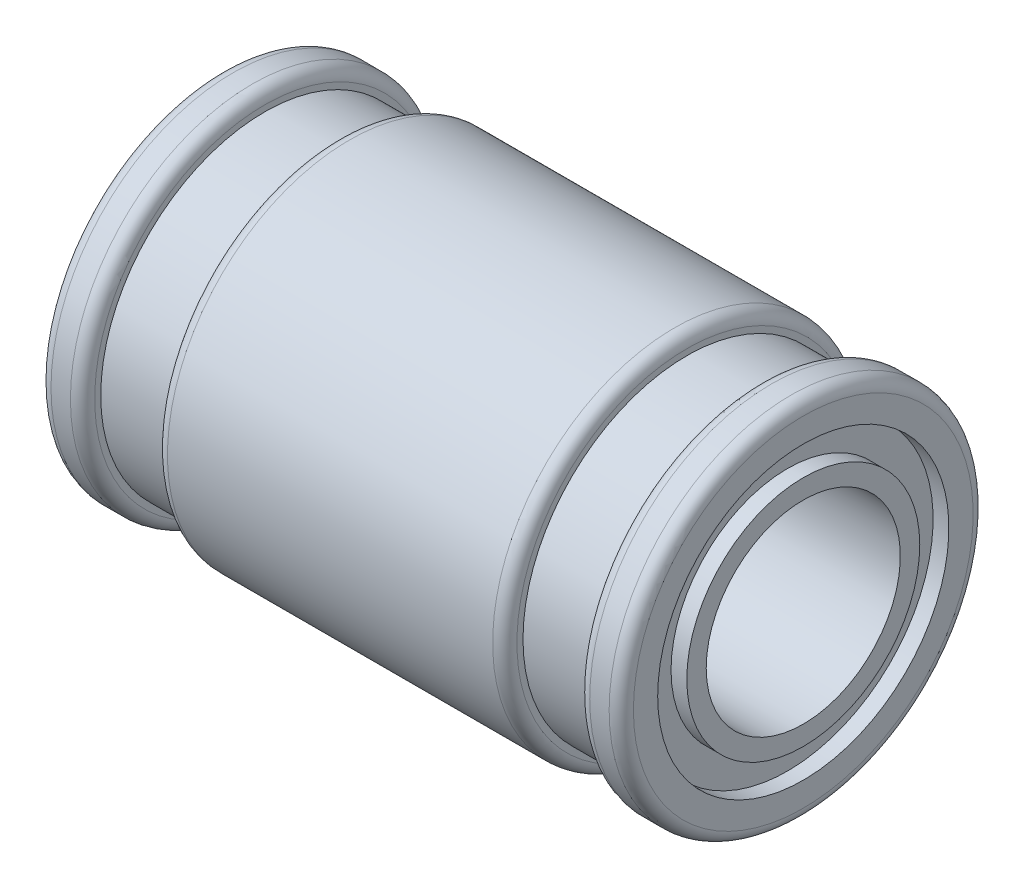
ISO-10303-21;
HEADER;
FILE_DESCRIPTION(('STEP AP214'),'2;1');
FILE_NAME('part.step','',(''),(''),'','','');
FILE_SCHEMA(('AUTOMOTIVE_DESIGN { 1 0 10303 214 1 1 1 1 }'));
ENDSEC;
DATA;
#1=APPLICATION_CONTEXT('core data for automotive mechanical design processes');
#2=APPLICATION_PROTOCOL_DEFINITION('international standard','automotive_design',2000,#1);
#3=PRODUCT_CONTEXT('',#1,'mechanical');
#4=PRODUCT('Part','Part','',(#3));
#5=PRODUCT_RELATED_PRODUCT_CATEGORY('part','',(#4));
#6=PRODUCT_DEFINITION_FORMATION('','',#4);
#7=PRODUCT_DEFINITION_CONTEXT('part definition',#1,'design');
#8=PRODUCT_DEFINITION('design','',#6,#7);
#9=PRODUCT_DEFINITION_SHAPE('','',#8);
#10=(LENGTH_UNIT() NAMED_UNIT(*) SI_UNIT(.MILLI.,.METRE.));
#11=(NAMED_UNIT(*) PLANE_ANGLE_UNIT() SI_UNIT($,.RADIAN.));
#12=(NAMED_UNIT(*) SI_UNIT($,.STERADIAN.) SOLID_ANGLE_UNIT());
#13=UNCERTAINTY_MEASURE_WITH_UNIT(LENGTH_MEASURE(1.E-05),#10,'distance_accuracy_value','');
#14=(GEOMETRIC_REPRESENTATION_CONTEXT(3) GLOBAL_UNCERTAINTY_ASSIGNED_CONTEXT((#13)) GLOBAL_UNIT_ASSIGNED_CONTEXT((#10,
#11,#12)) REPRESENTATION_CONTEXT('',''));
#15=CARTESIAN_POINT('',(0.,0.,0.));
#16=DIRECTION('',(0.,0.,1.));
#17=DIRECTION('',(1.,0.,0.));
#18=AXIS2_PLACEMENT_3D('',#15,#16,#17);
#19=CARTESIAN_POINT('',(23.35,0.,0.));
#20=DIRECTION('',(1.,0.,0.));
#21=DIRECTION('',(0.,0.,-1.));
#22=AXIS2_PLACEMENT_3D('',#19,#20,#21);
#23=PLANE('',#22);
#24=CARTESIAN_POINT('',(23.35,0.,0.));
#25=DIRECTION('',(-1.,0.,0.));
#26=DIRECTION('',(0.,0.,1.));
#27=AXIS2_PLACEMENT_3D('',#24,#25,#26);
#28=CIRCLE('',#27,4.8);
#29=CARTESIAN_POINT('',(23.35,0.,4.8));
#30=VERTEX_POINT('',#29);
#31=EDGE_CURVE('E116',#30,#30,#28,.T.);
#32=ORIENTED_EDGE('',*,*,#31,.T.);
#33=EDGE_LOOP('',(#32));
#34=FACE_BOUND('',#33,.T.);
#35=CARTESIAN_POINT('',(23.35,0.,0.));
#36=DIRECTION('',(-1.,0.,0.));
#37=DIRECTION('',(0.,0.,1.));
#38=AXIS2_PLACEMENT_3D('',#35,#36,#37);
#39=CIRCLE('',#38,6.);
#40=CARTESIAN_POINT('',(23.35,0.,6.));
#41=VERTEX_POINT('',#40);
#42=EDGE_CURVE('E77',#41,#41,#39,.T.);
#43=ORIENTED_EDGE('',*,*,#42,.F.);
#44=EDGE_LOOP('',(#43));
#45=FACE_BOUND('',#44,.T.);
#46=ADVANCED_FACE('F33',(#34,#45),#23,.T.);
#47=CARTESIAN_POINT('',(0.,0.,0.));
#48=DIRECTION('',(-1.,0.,0.));
#49=DIRECTION('',(0.,0.,1.));
#50=AXIS2_PLACEMENT_3D('',#47,#48,#49);
#51=CYLINDRICAL_SURFACE('',#50,6.);
#52=ORIENTED_EDGE('',*,*,#42,.T.);
#53=EDGE_LOOP('',(#52));
#54=FACE_BOUND('',#53,.T.);
#55=CARTESIAN_POINT('',(24.,0.,0.));
#56=DIRECTION('',(-1.,0.,0.));
#57=DIRECTION('',(0.,0.,1.));
#58=AXIS2_PLACEMENT_3D('',#55,#56,#57);
#59=CIRCLE('',#58,6.);
#60=CARTESIAN_POINT('',(24.,0.,6.));
#61=VERTEX_POINT('',#60);
#62=EDGE_CURVE('E80',#61,#61,#59,.T.);
#63=ORIENTED_EDGE('',*,*,#62,.F.);
#64=EDGE_LOOP('',(#63));
#65=FACE_BOUND('',#64,.T.);
#66=ADVANCED_FACE('F159',(#54,#65),#51,.F.);
#67=CARTESIAN_POINT('',(24.,0.,0.));
#68=DIRECTION('',(-1.,0.,0.));
#69=DIRECTION('',(0.,0.,1.));
#70=AXIS2_PLACEMENT_3D('',#67,#68,#69);
#71=PLANE('',#70);
#72=CARTESIAN_POINT('',(24.,0.,0.));
#73=DIRECTION('',(-1.,0.,0.));
#74=DIRECTION('',(0.,0.,1.));
#75=AXIS2_PLACEMENT_3D('',#72,#73,#74);
#76=CIRCLE('',#75,7.);
#77=CARTESIAN_POINT('',(24.,0.,7.));
#78=VERTEX_POINT('',#77);
#79=EDGE_CURVE('E40',#78,#78,#76,.F.);
#80=ORIENTED_EDGE('',*,*,#79,.T.);
#81=EDGE_LOOP('',(#80));
#82=FACE_BOUND('',#81,.T.);
#83=ORIENTED_EDGE('',*,*,#62,.T.);
#84=EDGE_LOOP('',(#83));
#85=FACE_BOUND('',#84,.T.);
#86=ADVANCED_FACE('F134',(#82,#85),#71,.F.);
#87=CARTESIAN_POINT('',(0.,0.,0.));
#88=DIRECTION('',(-1.,0.,0.));
#89=DIRECTION('',(0.,0.,1.));
#90=AXIS2_PLACEMENT_3D('',#87,#88,#89);
#91=CYLINDRICAL_SURFACE('',#90,7.5);
#92=CARTESIAN_POINT('',(22.7,0.,0.));
#93=DIRECTION('',(1.,0.,0.));
#94=DIRECTION('',(0.,0.,-1.));
#95=AXIS2_PLACEMENT_3D('',#92,#93,#94);
#96=CIRCLE('',#95,7.5);
#97=CARTESIAN_POINT('',(22.7,0.,-7.5));
#98=VERTEX_POINT('',#97);
#99=EDGE_CURVE('E44',#98,#98,#96,.T.);
#100=ORIENTED_EDGE('',*,*,#99,.T.);
#101=EDGE_LOOP('',(#100));
#102=FACE_BOUND('',#101,.T.);
#103=CARTESIAN_POINT('',(23.5,0.,0.));
#104=DIRECTION('',(-1.,0.,0.));
#105=DIRECTION('',(0.,0.,1.));
#106=AXIS2_PLACEMENT_3D('',#103,#104,#105);
#107=CIRCLE('',#106,7.5);
#108=CARTESIAN_POINT('',(23.5,0.,7.5));
#109=VERTEX_POINT('',#108);
#110=EDGE_CURVE('E48',#109,#109,#107,.T.);
#111=ORIENTED_EDGE('',*,*,#110,.T.);
#112=EDGE_LOOP('',(#111));
#113=FACE_BOUND('',#112,.T.);
#114=ADVANCED_FACE('F192',(#102,#113),#91,.T.);
#115=CARTESIAN_POINT('',(22.2,0.,0.));
#116=DIRECTION('',(1.,0.,0.));
#117=DIRECTION('',(0.,0.,-1.));
#118=AXIS2_PLACEMENT_3D('',#115,#116,#117);
#119=PLANE('',#118);
#120=CARTESIAN_POINT('',(22.2,0.,0.));
#121=DIRECTION('',(1.,0.,0.));
#122=DIRECTION('',(0.,0.,-1.));
#123=AXIS2_PLACEMENT_3D('',#120,#121,#122);
#124=CIRCLE('',#123,7.);
#125=CARTESIAN_POINT('',(22.2,0.,-7.));
#126=VERTEX_POINT('',#125);
#127=EDGE_CURVE('E53',#126,#126,#124,.F.);
#128=ORIENTED_EDGE('',*,*,#127,.T.);
#129=EDGE_LOOP('',(#128));
#130=FACE_BOUND('',#129,.T.);
#131=CARTESIAN_POINT('',(22.2,0.,0.));
#132=DIRECTION('',(-1.,0.,0.));
#133=DIRECTION('',(0.,0.,1.));
#134=AXIS2_PLACEMENT_3D('',#131,#132,#133);
#135=CIRCLE('',#134,6.75);
#136=CARTESIAN_POINT('',(22.2,0.,6.75));
#137=VERTEX_POINT('',#136);
#138=EDGE_CURVE('E83',#137,#137,#135,.T.);
#139=ORIENTED_EDGE('',*,*,#138,.F.);
#140=EDGE_LOOP('',(#139));
#141=FACE_BOUND('',#140,.T.);
#142=ADVANCED_FACE('F194',(#130,#141),#119,.F.);
#143=CARTESIAN_POINT('',(0.,0.,0.));
#144=DIRECTION('',(-1.,0.,0.));
#145=DIRECTION('',(0.,0.,1.));
#146=AXIS2_PLACEMENT_3D('',#143,#144,#145);
#147=CYLINDRICAL_SURFACE('',#146,6.75);
#148=ORIENTED_EDGE('',*,*,#138,.T.);
#149=EDGE_LOOP('',(#148));
#150=FACE_BOUND('',#149,.T.);
#151=CARTESIAN_POINT('',(19.2,0.,0.));
#152=DIRECTION('',(-1.,0.,0.));
#153=DIRECTION('',(0.,0.,1.));
#154=AXIS2_PLACEMENT_3D('',#151,#152,#153);
#155=CIRCLE('',#154,6.75);
#156=CARTESIAN_POINT('',(19.2,0.,6.75));
#157=VERTEX_POINT('',#156);
#158=EDGE_CURVE('E86',#157,#157,#155,.T.);
#159=ORIENTED_EDGE('',*,*,#158,.F.);
#160=EDGE_LOOP('',(#159));
#161=FACE_BOUND('',#160,.T.);
#162=ADVANCED_FACE('F202',(#150,#161),#147,.T.);
#163=CARTESIAN_POINT('',(19.2,0.,0.));
#164=DIRECTION('',(1.,0.,0.));
#165=DIRECTION('',(0.,0.,-1.));
#166=AXIS2_PLACEMENT_3D('',#163,#164,#165);
#167=PLANE('',#166);
#168=CARTESIAN_POINT('',(19.2,0.,0.));
#169=DIRECTION('',(1.,0.,0.));
#170=DIRECTION('',(0.,0.,-1.));
#171=AXIS2_PLACEMENT_3D('',#168,#169,#170);
#172=CIRCLE('',#171,7.);
#173=CARTESIAN_POINT('',(19.2,0.,-7.));
#174=VERTEX_POINT('',#173);
#175=EDGE_CURVE('E56',#174,#174,#172,.T.);
#176=ORIENTED_EDGE('',*,*,#175,.T.);
#177=EDGE_LOOP('',(#176));
#178=FACE_BOUND('',#177,.T.);
#179=ORIENTED_EDGE('',*,*,#158,.T.);
#180=EDGE_LOOP('',(#179));
#181=FACE_BOUND('',#180,.T.);
#182=ADVANCED_FACE('F208',(#178,#181),#167,.T.);
#183=CARTESIAN_POINT('',(18.7,0.,0.));
#184=DIRECTION('',(1.,0.,0.));
#185=DIRECTION('',(0.,0.,-1.));
#186=AXIS2_PLACEMENT_3D('',#183,#184,#185);
#187=CIRCLE('',#186,7.5);
#188=CARTESIAN_POINT('',(18.7,0.,-7.5));
#189=VERTEX_POINT('',#188);
#190=EDGE_CURVE('E59',#189,#189,#187,.F.);
#191=ORIENTED_EDGE('',*,*,#190,.T.);
#192=EDGE_LOOP('',(#191));
#193=FACE_BOUND('',#192,.T.);
#194=CARTESIAN_POINT('',(5.3,0.,0.));
#195=DIRECTION('',(1.,0.,0.));
#196=DIRECTION('',(0.,0.,-1.));
#197=AXIS2_PLACEMENT_3D('',#194,#195,#196);
#198=CIRCLE('',#197,7.5);
#199=CARTESIAN_POINT('',(5.3,0.,-7.5));
#200=VERTEX_POINT('',#199);
#201=EDGE_CURVE('E62',#200,#200,#198,.T.);
#202=ORIENTED_EDGE('',*,*,#201,.T.);
#203=EDGE_LOOP('',(#202));
#204=FACE_BOUND('',#203,.T.);
#205=ADVANCED_FACE('F197',(#193,#204),#91,.T.);
#206=CARTESIAN_POINT('',(4.8,0.,0.));
#207=DIRECTION('',(1.,0.,0.));
#208=DIRECTION('',(0.,0.,-1.));
#209=AXIS2_PLACEMENT_3D('',#206,#207,#208);
#210=PLANE('',#209);
#211=CARTESIAN_POINT('',(4.8,0.,0.));
#212=DIRECTION('',(1.,0.,0.));
#213=DIRECTION('',(0.,0.,-1.));
#214=AXIS2_PLACEMENT_3D('',#211,#212,#213);
#215=CIRCLE('',#214,7.);
#216=CARTESIAN_POINT('',(4.8,0.,-7.));
#217=VERTEX_POINT('',#216);
#218=EDGE_CURVE('E10',#217,#217,#215,.F.);
#219=ORIENTED_EDGE('',*,*,#218,.T.);
#220=EDGE_LOOP('',(#219));
#221=FACE_BOUND('',#220,.T.);
#222=CARTESIAN_POINT('',(4.8,0.,0.));
#223=DIRECTION('',(-1.,0.,0.));
#224=DIRECTION('',(0.,0.,1.));
#225=AXIS2_PLACEMENT_3D('',#222,#223,#224);
#226=CIRCLE('',#225,6.75);
#227=CARTESIAN_POINT('',(4.8,0.,6.75));
#228=VERTEX_POINT('',#227);
#229=EDGE_CURVE('E89',#228,#228,#226,.T.);
#230=ORIENTED_EDGE('',*,*,#229,.F.);
#231=EDGE_LOOP('',(#230));
#232=FACE_BOUND('',#231,.T.);
#233=ADVANCED_FACE('F207',(#221,#232),#210,.F.);
#234=CARTESIAN_POINT('',(0.,0.,0.));
#235=DIRECTION('',(-1.,0.,0.));
#236=DIRECTION('',(0.,0.,1.));
#237=AXIS2_PLACEMENT_3D('',#234,#235,#236);
#238=CYLINDRICAL_SURFACE('',#237,6.75);
#239=ORIENTED_EDGE('',*,*,#229,.T.);
#240=EDGE_LOOP('',(#239));
#241=FACE_BOUND('',#240,.T.);
#242=CARTESIAN_POINT('',(1.8,0.,0.));
#243=DIRECTION('',(-1.,0.,0.));
#244=DIRECTION('',(0.,0.,1.));
#245=AXIS2_PLACEMENT_3D('',#242,#243,#244);
#246=CIRCLE('',#245,6.75);
#247=CARTESIAN_POINT('',(1.8,0.,6.75));
#248=VERTEX_POINT('',#247);
#249=EDGE_CURVE('E92',#248,#248,#246,.T.);
#250=ORIENTED_EDGE('',*,*,#249,.F.);
#251=EDGE_LOOP('',(#250));
#252=FACE_BOUND('',#251,.T.);
#253=ADVANCED_FACE('F216',(#241,#252),#238,.T.);
#254=CARTESIAN_POINT('',(1.8,0.,0.));
#255=DIRECTION('',(1.,0.,0.));
#256=DIRECTION('',(0.,0.,-1.));
#257=AXIS2_PLACEMENT_3D('',#254,#255,#256);
#258=PLANE('',#257);
#259=CARTESIAN_POINT('',(1.8,0.,0.));
#260=DIRECTION('',(1.,0.,0.));
#261=DIRECTION('',(0.,0.,-1.));
#262=AXIS2_PLACEMENT_3D('',#259,#260,#261);
#263=CIRCLE('',#262,7.);
#264=CARTESIAN_POINT('',(1.8,0.,-7.));
#265=VERTEX_POINT('',#264);
#266=EDGE_CURVE('E65',#265,#265,#263,.T.);
#267=ORIENTED_EDGE('',*,*,#266,.T.);
#268=EDGE_LOOP('',(#267));
#269=FACE_BOUND('',#268,.T.);
#270=ORIENTED_EDGE('',*,*,#249,.T.);
#271=EDGE_LOOP('',(#270));
#272=FACE_BOUND('',#271,.T.);
#273=ADVANCED_FACE('F211',(#269,#272),#258,.T.);
#274=CARTESIAN_POINT('',(1.3,0.,0.));
#275=DIRECTION('',(1.,0.,0.));
#276=DIRECTION('',(0.,0.,-1.));
#277=AXIS2_PLACEMENT_3D('',#274,#275,#276);
#278=CIRCLE('',#277,7.5);
#279=CARTESIAN_POINT('',(1.3,0.,-7.5));
#280=VERTEX_POINT('',#279);
#281=EDGE_CURVE('E68',#280,#280,#278,.F.);
#282=ORIENTED_EDGE('',*,*,#281,.T.);
#283=EDGE_LOOP('',(#282));
#284=FACE_BOUND('',#283,.T.);
#285=CARTESIAN_POINT('',(0.5,0.,0.));
#286=DIRECTION('',(-1.,0.,0.));
#287=DIRECTION('',(0.,0.,1.));
#288=AXIS2_PLACEMENT_3D('',#285,#286,#287);
#289=CIRCLE('',#288,7.5);
#290=CARTESIAN_POINT('',(0.5,0.,7.5));
#291=VERTEX_POINT('',#290);
#292=EDGE_CURVE('E71',#291,#291,#289,.F.);
#293=ORIENTED_EDGE('',*,*,#292,.T.);
#294=EDGE_LOOP('',(#293));
#295=FACE_BOUND('',#294,.T.);
#296=ADVANCED_FACE('F156',(#284,#295),#91,.T.);
#297=CARTESIAN_POINT('',(0.,0.,0.));
#298=DIRECTION('',(-1.,0.,0.));
#299=DIRECTION('',(0.,0.,1.));
#300=AXIS2_PLACEMENT_3D('',#297,#298,#299);
#301=PLANE('',#300);
#302=CARTESIAN_POINT('',(0.,0.,0.));
#303=DIRECTION('',(-1.,0.,0.));
#304=DIRECTION('',(0.,0.,1.));
#305=AXIS2_PLACEMENT_3D('',#302,#303,#304);
#306=CIRCLE('',#305,7.);
#307=CARTESIAN_POINT('',(0.,0.,7.));
#308=VERTEX_POINT('',#307);
#309=EDGE_CURVE('E74',#308,#308,#306,.T.);
#310=ORIENTED_EDGE('',*,*,#309,.T.);
#311=EDGE_LOOP('',(#310));
#312=FACE_BOUND('',#311,.T.);
#313=CARTESIAN_POINT('',(0.,0.,0.));
#314=DIRECTION('',(-1.,0.,0.));
#315=DIRECTION('',(0.,0.,1.));
#316=AXIS2_PLACEMENT_3D('',#313,#314,#315);
#317=CIRCLE('',#316,6.);
#318=CARTESIAN_POINT('',(0.,0.,6.));
#319=VERTEX_POINT('',#318);
#320=EDGE_CURVE('E95',#319,#319,#317,.T.);
#321=ORIENTED_EDGE('',*,*,#320,.F.);
#322=EDGE_LOOP('',(#321));
#323=FACE_BOUND('',#322,.T.);
#324=ADVANCED_FACE('F147',(#312,#323),#301,.T.);
#325=CARTESIAN_POINT('',(0.,0.,0.));
#326=DIRECTION('',(-1.,0.,0.));
#327=DIRECTION('',(0.,0.,1.));
#328=AXIS2_PLACEMENT_3D('',#325,#326,#327);
#329=CYLINDRICAL_SURFACE('',#328,6.);
#330=CARTESIAN_POINT('',(0.65,0.,0.));
#331=DIRECTION('',(-1.,0.,0.));
#332=DIRECTION('',(0.,0.,1.));
#333=AXIS2_PLACEMENT_3D('',#330,#331,#332);
#334=CIRCLE('',#333,6.);
#335=CARTESIAN_POINT('',(0.65,0.,6.));
#336=VERTEX_POINT('',#335);
#337=EDGE_CURVE('E98',#336,#336,#334,.T.);
#338=ORIENTED_EDGE('',*,*,#337,.F.);
#339=EDGE_LOOP('',(#338));
#340=FACE_BOUND('',#339,.T.);
#341=ORIENTED_EDGE('',*,*,#320,.T.);
#342=EDGE_LOOP('',(#341));
#343=FACE_BOUND('',#342,.T.);
#344=ADVANCED_FACE('F155',(#340,#343),#329,.F.);
#345=CARTESIAN_POINT('',(0.65,0.,0.));
#346=DIRECTION('',(1.,0.,0.));
#347=DIRECTION('',(0.,0.,-1.));
#348=AXIS2_PLACEMENT_3D('',#345,#346,#347);
#349=PLANE('',#348);
#350=CARTESIAN_POINT('',(0.65,0.,0.));
#351=DIRECTION('',(-1.,0.,0.));
#352=DIRECTION('',(0.,0.,1.));
#353=AXIS2_PLACEMENT_3D('',#350,#351,#352);
#354=CIRCLE('',#353,4.8);
#355=CARTESIAN_POINT('',(0.65,0.,4.8));
#356=VERTEX_POINT('',#355);
#357=EDGE_CURVE('E101',#356,#356,#354,.T.);
#358=ORIENTED_EDGE('',*,*,#357,.F.);
#359=EDGE_LOOP('',(#358));
#360=FACE_BOUND('',#359,.T.);
#361=ORIENTED_EDGE('',*,*,#337,.T.);
#362=EDGE_LOOP('',(#361));
#363=FACE_BOUND('',#362,.T.);
#364=ADVANCED_FACE('F151',(#360,#363),#349,.F.);
#365=CARTESIAN_POINT('',(0.,0.,0.));
#366=DIRECTION('',(-1.,0.,0.));
#367=DIRECTION('',(0.,0.,1.));
#368=AXIS2_PLACEMENT_3D('',#365,#366,#367);
#369=CYLINDRICAL_SURFACE('',#368,4.8);
#370=ORIENTED_EDGE('',*,*,#357,.T.);
#371=EDGE_LOOP('',(#370));
#372=FACE_BOUND('',#371,.T.);
#373=CARTESIAN_POINT('',(0.,0.,0.));
#374=DIRECTION('',(-1.,0.,0.));
#375=DIRECTION('',(0.,0.,1.));
#376=AXIS2_PLACEMENT_3D('',#373,#374,#375);
#377=CIRCLE('',#376,4.8);
#378=CARTESIAN_POINT('',(0.,0.,4.8));
#379=VERTEX_POINT('',#378);
#380=EDGE_CURVE('E104',#379,#379,#377,.T.);
#381=ORIENTED_EDGE('',*,*,#380,.F.);
#382=EDGE_LOOP('',(#381));
#383=FACE_BOUND('',#382,.T.);
#384=ADVANCED_FACE('F144',(#372,#383),#369,.T.);
#385=ORIENTED_EDGE('',*,*,#380,.T.);
#386=EDGE_LOOP('',(#385));
#387=FACE_BOUND('',#386,.T.);
#388=CARTESIAN_POINT('',(0.,0.,0.));
#389=DIRECTION('',(-1.,0.,0.));
#390=DIRECTION('',(0.,0.,1.));
#391=AXIS2_PLACEMENT_3D('',#388,#389,#390);
#392=CIRCLE('',#391,4.);
#393=CARTESIAN_POINT('',(0.,0.,4.));
#394=VERTEX_POINT('',#393);
#395=EDGE_CURVE('E107',#394,#394,#392,.T.);
#396=ORIENTED_EDGE('',*,*,#395,.F.);
#397=EDGE_LOOP('',(#396));
#398=FACE_BOUND('',#397,.T.);
#399=ADVANCED_FACE('F139',(#387,#398),#301,.T.);
#400=CARTESIAN_POINT('',(0.,0.,0.));
#401=DIRECTION('',(-1.,0.,0.));
#402=DIRECTION('',(0.,0.,1.));
#403=AXIS2_PLACEMENT_3D('',#400,#401,#402);
#404=CYLINDRICAL_SURFACE('',#403,4.);
#405=CARTESIAN_POINT('',(24.,0.,0.));
#406=DIRECTION('',(-1.,0.,0.));
#407=DIRECTION('',(0.,0.,1.));
#408=AXIS2_PLACEMENT_3D('',#405,#406,#407);
#409=CIRCLE('',#408,4.);
#410=CARTESIAN_POINT('',(24.,0.,4.));
#411=VERTEX_POINT('',#410);
#412=EDGE_CURVE('E110',#411,#411,#409,.T.);
#413=ORIENTED_EDGE('',*,*,#412,.F.);
#414=EDGE_LOOP('',(#413));
#415=FACE_BOUND('',#414,.T.);
#416=ORIENTED_EDGE('',*,*,#395,.T.);
#417=EDGE_LOOP('',(#416));
#418=FACE_BOUND('',#417,.T.);
#419=ADVANCED_FACE('F132',(#415,#418),#404,.F.);
#420=CARTESIAN_POINT('',(24.,0.,0.));
#421=DIRECTION('',(-1.,0.,0.));
#422=DIRECTION('',(0.,0.,1.));
#423=AXIS2_PLACEMENT_3D('',#420,#421,#422);
#424=CIRCLE('',#423,4.8);
#425=CARTESIAN_POINT('',(24.,0.,4.8));
#426=VERTEX_POINT('',#425);
#427=EDGE_CURVE('E113',#426,#426,#424,.T.);
#428=ORIENTED_EDGE('',*,*,#427,.F.);
#429=EDGE_LOOP('',(#428));
#430=FACE_BOUND('',#429,.T.);
#431=ORIENTED_EDGE('',*,*,#412,.T.);
#432=EDGE_LOOP('',(#431));
#433=FACE_BOUND('',#432,.T.);
#434=ADVANCED_FACE('F126',(#430,#433),#71,.F.);
#435=CARTESIAN_POINT('',(0.,0.,0.));
#436=DIRECTION('',(-1.,0.,0.));
#437=DIRECTION('',(0.,0.,1.));
#438=AXIS2_PLACEMENT_3D('',#435,#436,#437);
#439=CYLINDRICAL_SURFACE('',#438,4.8);
#440=ORIENTED_EDGE('',*,*,#31,.F.);
#441=EDGE_LOOP('',(#440));
#442=FACE_BOUND('',#441,.T.);
#443=ORIENTED_EDGE('',*,*,#427,.T.);
#444=EDGE_LOOP('',(#443));
#445=FACE_BOUND('',#444,.T.);
#446=ADVANCED_FACE('F122',(#442,#445),#439,.T.);
#447=CARTESIAN_POINT('',(0.5,0.,0.));
#448=DIRECTION('',(-1.,0.,0.));
#449=DIRECTION('',(0.,0.,1.));
#450=AXIS2_PLACEMENT_3D('',#447,#448,#449);
#451=TOROIDAL_SURFACE('',#450,7.,0.5);
#452=ORIENTED_EDGE('',*,*,#292,.F.);
#453=EDGE_LOOP('',(#452));
#454=FACE_BOUND('',#453,.T.);
#455=ORIENTED_EDGE('',*,*,#309,.F.);
#456=EDGE_LOOP('',(#455));
#457=FACE_BOUND('',#456,.T.);
#458=ADVANCED_FACE('F125',(#454,#457),#451,.T.);
#459=CARTESIAN_POINT('',(1.3,0.,0.));
#460=DIRECTION('',(1.,0.,0.));
#461=DIRECTION('',(0.,0.,-1.));
#462=AXIS2_PLACEMENT_3D('',#459,#460,#461);
#463=TOROIDAL_SURFACE('',#462,7.,0.5);
#464=ORIENTED_EDGE('',*,*,#266,.F.);
#465=EDGE_LOOP('',(#464));
#466=FACE_BOUND('',#465,.T.);
#467=ORIENTED_EDGE('',*,*,#281,.F.);
#468=EDGE_LOOP('',(#467));
#469=FACE_BOUND('',#468,.T.);
#470=ADVANCED_FACE('F170',(#466,#469),#463,.T.);
#471=CARTESIAN_POINT('',(18.7,0.,0.));
#472=DIRECTION('',(1.,0.,0.));
#473=DIRECTION('',(0.,0.,-1.));
#474=AXIS2_PLACEMENT_3D('',#471,#472,#473);
#475=TOROIDAL_SURFACE('',#474,7.,0.5);
#476=ORIENTED_EDGE('',*,*,#175,.F.);
#477=EDGE_LOOP('',(#476));
#478=FACE_BOUND('',#477,.T.);
#479=ORIENTED_EDGE('',*,*,#190,.F.);
#480=EDGE_LOOP('',(#479));
#481=FACE_BOUND('',#480,.T.);
#482=ADVANCED_FACE('F174',(#478,#481),#475,.T.);
#483=CARTESIAN_POINT('',(22.7,0.,0.));
#484=DIRECTION('',(1.,0.,0.));
#485=DIRECTION('',(0.,0.,-1.));
#486=AXIS2_PLACEMENT_3D('',#483,#484,#485);
#487=TOROIDAL_SURFACE('',#486,7.,0.5);
#488=ORIENTED_EDGE('',*,*,#99,.F.);
#489=EDGE_LOOP('',(#488));
#490=FACE_BOUND('',#489,.T.);
#491=ORIENTED_EDGE('',*,*,#127,.F.);
#492=EDGE_LOOP('',(#491));
#493=FACE_BOUND('',#492,.T.);
#494=ADVANCED_FACE('F178',(#490,#493),#487,.T.);
#495=CARTESIAN_POINT('',(23.5,0.,0.));
#496=DIRECTION('',(-1.,0.,0.));
#497=DIRECTION('',(0.,0.,1.));
#498=AXIS2_PLACEMENT_3D('',#495,#496,#497);
#499=TOROIDAL_SURFACE('',#498,7.,0.5);
#500=ORIENTED_EDGE('',*,*,#79,.F.);
#501=EDGE_LOOP('',(#500));
#502=FACE_BOUND('',#501,.T.);
#503=ORIENTED_EDGE('',*,*,#110,.F.);
#504=EDGE_LOOP('',(#503));
#505=FACE_BOUND('',#504,.T.);
#506=ADVANCED_FACE('F181',(#502,#505),#499,.T.);
#507=CARTESIAN_POINT('',(5.3,0.,0.));
#508=DIRECTION('',(1.,0.,0.));
#509=DIRECTION('',(0.,0.,-1.));
#510=AXIS2_PLACEMENT_3D('',#507,#508,#509);
#511=TOROIDAL_SURFACE('',#510,7.,0.5);
#512=ORIENTED_EDGE('',*,*,#201,.F.);
#513=EDGE_LOOP('',(#512));
#514=FACE_BOUND('',#513,.T.);
#515=ORIENTED_EDGE('',*,*,#218,.F.);
#516=EDGE_LOOP('',(#515));
#517=FACE_BOUND('',#516,.T.);
#518=ADVANCED_FACE('F35',(#514,#517),#511,.T.);
#519=CLOSED_SHELL('',(#46,#66,#86,#114,#142,#162,#182,#205,#233,#253,#273,#296,#324,#344,#364,
#384,#399,#419,#434,#446,#458,#470,#482,#494,#506,#518));
#520=MANIFOLD_SOLID_BREP('B2',#519);
#521=ADVANCED_BREP_SHAPE_REPRESENTATION('',(#18,#520),#14);
#522=SHAPE_DEFINITION_REPRESENTATION(#9,#521);
ENDSEC;
END-ISO-10303-21;
